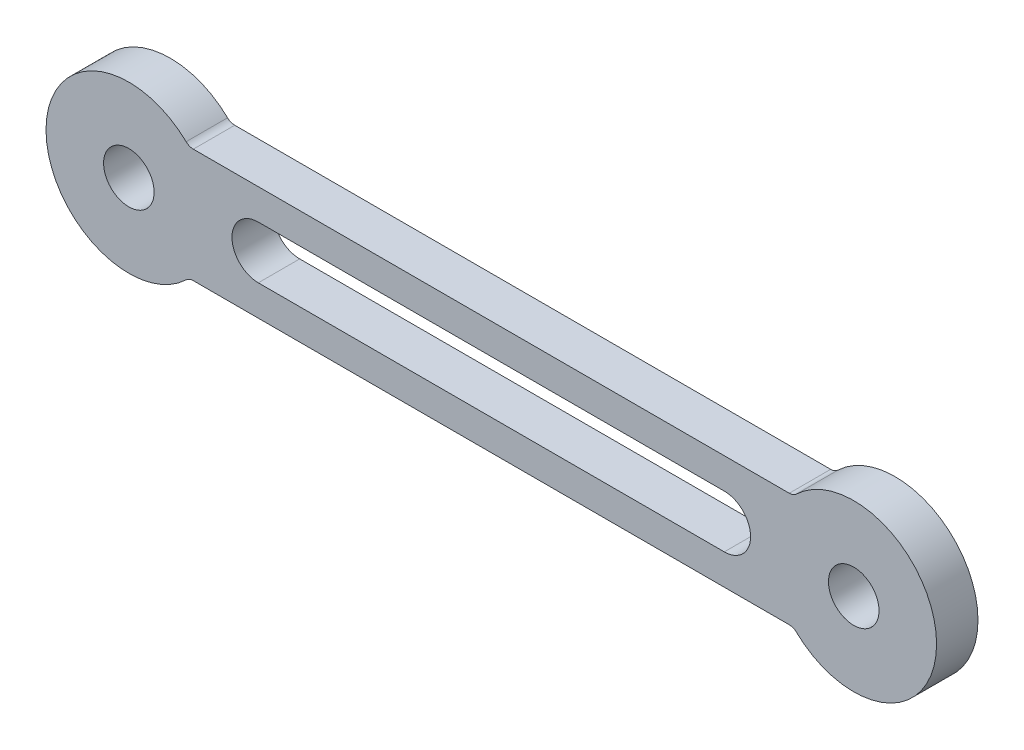
ISO-10303-21;
HEADER;
FILE_DESCRIPTION(('STEP AP214'),'2;1');
FILE_NAME('part.step','',(''),(''),'','','');
FILE_SCHEMA(('AUTOMOTIVE_DESIGN { 1 0 10303 214 1 1 1 1 }'));
ENDSEC;
DATA;
#1=APPLICATION_CONTEXT('core data for automotive mechanical design processes');
#2=APPLICATION_PROTOCOL_DEFINITION('international standard','automotive_design',2000,#1);
#3=PRODUCT_CONTEXT('',#1,'mechanical');
#4=PRODUCT('Part','Part','',(#3));
#5=PRODUCT_RELATED_PRODUCT_CATEGORY('part','',(#4));
#6=PRODUCT_DEFINITION_FORMATION('','',#4);
#7=PRODUCT_DEFINITION_CONTEXT('part definition',#1,'design');
#8=PRODUCT_DEFINITION('design','',#6,#7);
#9=PRODUCT_DEFINITION_SHAPE('','',#8);
#10=(LENGTH_UNIT() NAMED_UNIT(*) SI_UNIT(.MILLI.,.METRE.));
#11=(NAMED_UNIT(*) PLANE_ANGLE_UNIT() SI_UNIT($,.RADIAN.));
#12=(NAMED_UNIT(*) SI_UNIT($,.STERADIAN.) SOLID_ANGLE_UNIT());
#13=UNCERTAINTY_MEASURE_WITH_UNIT(LENGTH_MEASURE(1.E-05),#10,'distance_accuracy_value','');
#14=(GEOMETRIC_REPRESENTATION_CONTEXT(3) GLOBAL_UNCERTAINTY_ASSIGNED_CONTEXT((#13)) GLOBAL_UNIT_ASSIGNED_CONTEXT((#10,
#11,#12)) REPRESENTATION_CONTEXT('',''));
#15=CARTESIAN_POINT('',(0.,0.,0.));
#16=DIRECTION('',(0.,0.,1.));
#17=DIRECTION('',(1.,0.,0.));
#18=AXIS2_PLACEMENT_3D('',#15,#16,#17);
#19=CARTESIAN_POINT('',(0.,-5.5,4.));
#20=DIRECTION('',(0.,1.,0.));
#21=DIRECTION('',(-1.,0.,0.));
#22=AXIS2_PLACEMENT_3D('',#19,#20,#21);
#23=PLANE('',#22);
#24=DIRECTION('',(1.,0.,0.));
#25=VECTOR('',#24,1.);
#26=CARTESIAN_POINT('',(0.,-5.5,0.));
#27=LINE('',#26,#25);
#28=CARTESIAN_POINT('',(-28.7750502010056,-5.5,0.));
#29=VERTEX_POINT('',#28);
#30=CARTESIAN_POINT('',(28.7750502010057,-5.5,0.));
#31=VERTEX_POINT('',#30);
#32=EDGE_CURVE('E189',#29,#31,#27,.T.);
#33=ORIENTED_EDGE('',*,*,#32,.T.);
#34=DIRECTION('',(0.,0.,1.));
#35=VECTOR('',#34,1.);
#36=CARTESIAN_POINT('',(28.7750502010057,-5.5,4.));
#37=LINE('',#36,#35);
#38=CARTESIAN_POINT('',(28.7750502010057,-5.5,4.));
#39=VERTEX_POINT('',#38);
#40=EDGE_CURVE('E58',#31,#39,#37,.T.);
#41=ORIENTED_EDGE('',*,*,#40,.T.);
#42=DIRECTION('',(1.,0.,0.));
#43=VECTOR('',#42,1.);
#44=CARTESIAN_POINT('',(0.,-5.5,4.));
#45=LINE('',#44,#43);
#46=CARTESIAN_POINT('',(-28.7750502010056,-5.5,4.));
#47=VERTEX_POINT('',#46);
#48=EDGE_CURVE('E163',#47,#39,#45,.T.);
#49=ORIENTED_EDGE('',*,*,#48,.F.);
#50=DIRECTION('',(0.,0.,1.));
#51=VECTOR('',#50,1.);
#52=CARTESIAN_POINT('',(-28.7750502010056,-5.5,0.));
#53=LINE('',#52,#51);
#54=EDGE_CURVE('E210',#47,#29,#53,.F.);
#55=ORIENTED_EDGE('',*,*,#54,.T.);
#56=EDGE_LOOP('',(#33,#41,#49,#55));
#57=FACE_BOUND('',#56,.T.);
#58=ADVANCED_FACE('F37',(#57),#23,.F.);
#59=CARTESIAN_POINT('',(35.,0.,4.));
#60=DIRECTION('',(0.,0.,-1.));
#61=DIRECTION('',(-1.,0.,0.));
#62=AXIS2_PLACEMENT_3D('',#59,#60,#61);
#63=CYLINDRICAL_SURFACE('',#62,7.99999999999999);
#64=CARTESIAN_POINT('',(35.,0.,4.));
#65=DIRECTION('',(0.,0.,1.));
#66=DIRECTION('',(1.,0.,0.));
#67=AXIS2_PLACEMENT_3D('',#64,#65,#66);
#68=CIRCLE('',#67,7.99999999999999);
#69=CARTESIAN_POINT('',(29.4667112897828,-5.77777777777778,4.));
#70=VERTEX_POINT('',#69);
#71=CARTESIAN_POINT('',(29.4667112897828,5.77777777777778,4.));
#72=VERTEX_POINT('',#71);
#73=EDGE_CURVE('E165',#70,#72,#68,.T.);
#74=ORIENTED_EDGE('',*,*,#73,.F.);
#75=DIRECTION('',(0.,0.,-1.));
#76=VECTOR('',#75,1.);
#77=CARTESIAN_POINT('',(29.4667112897828,-5.77777777777778,4.));
#78=LINE('',#77,#76);
#79=CARTESIAN_POINT('',(29.4667112897828,-5.77777777777778,0.));
#80=VERTEX_POINT('',#79);
#81=EDGE_CURVE('E230',#70,#80,#78,.T.);
#82=ORIENTED_EDGE('',*,*,#81,.T.);
#83=CARTESIAN_POINT('',(35.,0.,0.));
#84=DIRECTION('',(0.,0.,1.));
#85=DIRECTION('',(1.,0.,0.));
#86=AXIS2_PLACEMENT_3D('',#83,#84,#85);
#87=CIRCLE('',#86,7.99999999999999);
#88=CARTESIAN_POINT('',(29.4667112897828,5.77777777777778,0.));
#89=VERTEX_POINT('',#88);
#90=EDGE_CURVE('E191',#80,#89,#87,.T.);
#91=ORIENTED_EDGE('',*,*,#90,.T.);
#92=DIRECTION('',(0.,0.,-1.));
#93=VECTOR('',#92,1.);
#94=CARTESIAN_POINT('',(29.4667112897828,5.77777777777778,4.));
#95=LINE('',#94,#93);
#96=EDGE_CURVE('E222',#89,#72,#95,.F.);
#97=ORIENTED_EDGE('',*,*,#96,.T.);
#98=EDGE_LOOP('',(#74,#82,#91,#97));
#99=FACE_BOUND('',#98,.T.);
#100=ADVANCED_FACE('F236',(#99),#63,.T.);
#101=CARTESIAN_POINT('',(0.,5.5,4.));
#102=DIRECTION('',(0.,1.,0.));
#103=DIRECTION('',(-1.,0.,0.));
#104=AXIS2_PLACEMENT_3D('',#101,#102,#103);
#105=PLANE('',#104);
#106=DIRECTION('',(1.,0.,0.));
#107=VECTOR('',#106,1.);
#108=CARTESIAN_POINT('',(0.,5.5,4.));
#109=LINE('',#108,#107);
#110=CARTESIAN_POINT('',(-28.7750502010056,5.5,4.));
#111=VERTEX_POINT('',#110);
#112=CARTESIAN_POINT('',(28.7750502010056,5.5,4.));
#113=VERTEX_POINT('',#112);
#114=EDGE_CURVE('E167',#111,#113,#109,.T.);
#115=ORIENTED_EDGE('',*,*,#114,.T.);
#116=DIRECTION('',(0.,0.,-1.));
#117=VECTOR('',#116,1.);
#118=CARTESIAN_POINT('',(28.7750502010056,5.5,4.));
#119=LINE('',#118,#117);
#120=CARTESIAN_POINT('',(28.7750502010056,5.5,0.));
#121=VERTEX_POINT('',#120);
#122=EDGE_CURVE('E219',#113,#121,#119,.T.);
#123=ORIENTED_EDGE('',*,*,#122,.T.);
#124=DIRECTION('',(1.,0.,0.));
#125=VECTOR('',#124,1.);
#126=CARTESIAN_POINT('',(0.,5.5,0.));
#127=LINE('',#126,#125);
#128=CARTESIAN_POINT('',(-28.7750502010056,5.5,0.));
#129=VERTEX_POINT('',#128);
#130=EDGE_CURVE('E193',#129,#121,#127,.T.);
#131=ORIENTED_EDGE('',*,*,#130,.F.);
#132=DIRECTION('',(0.,0.,-1.));
#133=VECTOR('',#132,1.);
#134=CARTESIAN_POINT('',(-28.7750502010056,5.5,4.));
#135=LINE('',#134,#133);
#136=EDGE_CURVE('E204',#129,#111,#135,.F.);
#137=ORIENTED_EDGE('',*,*,#136,.T.);
#138=EDGE_LOOP('',(#115,#123,#131,#137));
#139=FACE_BOUND('',#138,.T.);
#140=ADVANCED_FACE('F250',(#139),#105,.T.);
#141=CARTESIAN_POINT('',(22.5,0.,4.));
#142=DIRECTION('',(0.,0.,-1.));
#143=DIRECTION('',(-1.,0.,0.));
#144=AXIS2_PLACEMENT_3D('',#141,#142,#143);
#145=CYLINDRICAL_SURFACE('',#144,2.54073400925871);
#146=CARTESIAN_POINT('',(22.5,0.,0.));
#147=DIRECTION('',(0.,0.,1.));
#148=DIRECTION('',(1.,0.,0.));
#149=AXIS2_PLACEMENT_3D('',#146,#147,#148);
#150=CIRCLE('',#149,2.54073400925871);
#151=CARTESIAN_POINT('',(22.5,-2.5407340092587,0.));
#152=VERTEX_POINT('',#151);
#153=CARTESIAN_POINT('',(22.5,2.54073400925871,0.));
#154=VERTEX_POINT('',#153);
#155=EDGE_CURVE('E131',#152,#154,#150,.T.);
#156=ORIENTED_EDGE('',*,*,#155,.F.);
#157=DIRECTION('',(0.,0.,-1.));
#158=VECTOR('',#157,1.);
#159=CARTESIAN_POINT('',(22.5,-2.5407340092587,4.));
#160=LINE('',#159,#158);
#161=CARTESIAN_POINT('',(22.5,-2.5407340092587,4.));
#162=VERTEX_POINT('',#161);
#163=EDGE_CURVE('E126',#162,#152,#160,.T.);
#164=ORIENTED_EDGE('',*,*,#163,.F.);
#165=CARTESIAN_POINT('',(22.5,0.,4.));
#166=DIRECTION('',(0.,0.,1.));
#167=DIRECTION('',(1.,0.,0.));
#168=AXIS2_PLACEMENT_3D('',#165,#166,#167);
#169=CIRCLE('',#168,2.54073400925871);
#170=CARTESIAN_POINT('',(22.5,2.54073400925871,4.));
#171=VERTEX_POINT('',#170);
#172=EDGE_CURVE('E129',#162,#171,#169,.T.);
#173=ORIENTED_EDGE('',*,*,#172,.T.);
#174=DIRECTION('',(0.,0.,-1.));
#175=VECTOR('',#174,1.);
#176=CARTESIAN_POINT('',(22.5,2.54073400925871,4.));
#177=LINE('',#176,#175);
#178=EDGE_CURVE('E173',#171,#154,#177,.T.);
#179=ORIENTED_EDGE('',*,*,#178,.T.);
#180=EDGE_LOOP('',(#156,#164,#173,#179));
#181=FACE_BOUND('',#180,.T.);
#182=ADVANCED_FACE('F128',(#181),#145,.F.);
#183=CARTESIAN_POINT('',(0.,-2.5407340092587,4.));
#184=DIRECTION('',(0.,1.,0.));
#185=DIRECTION('',(-1.,0.,0.));
#186=AXIS2_PLACEMENT_3D('',#183,#184,#185);
#187=PLANE('',#186);
#188=DIRECTION('',(1.,0.,0.));
#189=VECTOR('',#188,1.);
#190=CARTESIAN_POINT('',(0.,-2.5407340092587,0.));
#191=LINE('',#190,#189);
#192=CARTESIAN_POINT('',(-22.5,-2.54073400925871,0.));
#193=VERTEX_POINT('',#192);
#194=EDGE_CURVE('E175',#193,#152,#191,.T.);
#195=ORIENTED_EDGE('',*,*,#194,.F.);
#196=DIRECTION('',(0.,0.,-1.));
#197=VECTOR('',#196,1.);
#198=CARTESIAN_POINT('',(-22.5,-2.54073400925871,4.));
#199=LINE('',#198,#197);
#200=CARTESIAN_POINT('',(-22.5,-2.54073400925871,4.));
#201=VERTEX_POINT('',#200);
#202=EDGE_CURVE('E137',#201,#193,#199,.T.);
#203=ORIENTED_EDGE('',*,*,#202,.F.);
#204=DIRECTION('',(1.,0.,0.));
#205=VECTOR('',#204,1.);
#206=CARTESIAN_POINT('',(0.,-2.5407340092587,4.));
#207=LINE('',#206,#205);
#208=EDGE_CURVE('E144',#201,#162,#207,.T.);
#209=ORIENTED_EDGE('',*,*,#208,.T.);
#210=ORIENTED_EDGE('',*,*,#163,.T.);
#211=EDGE_LOOP('',(#195,#203,#209,#210));
#212=FACE_BOUND('',#211,.T.);
#213=ADVANCED_FACE('F151',(#212),#187,.T.);
#214=CARTESIAN_POINT('',(-22.5,0.,4.));
#215=DIRECTION('',(0.,0.,-1.));
#216=DIRECTION('',(-1.,0.,0.));
#217=AXIS2_PLACEMENT_3D('',#214,#215,#216);
#218=CYLINDRICAL_SURFACE('',#217,2.54073400925871);
#219=CARTESIAN_POINT('',(-22.5,0.,0.));
#220=DIRECTION('',(0.,0.,1.));
#221=DIRECTION('',(1.,0.,0.));
#222=AXIS2_PLACEMENT_3D('',#219,#220,#221);
#223=CIRCLE('',#222,2.54073400925871);
#224=CARTESIAN_POINT('',(-22.5,2.54073400925871,0.));
#225=VERTEX_POINT('',#224);
#226=EDGE_CURVE('E177',#225,#193,#223,.T.);
#227=ORIENTED_EDGE('',*,*,#226,.F.);
#228=DIRECTION('',(0.,0.,-1.));
#229=VECTOR('',#228,1.);
#230=CARTESIAN_POINT('',(-22.5,2.54073400925871,4.));
#231=LINE('',#230,#229);
#232=CARTESIAN_POINT('',(-22.5,2.54073400925871,4.));
#233=VERTEX_POINT('',#232);
#234=EDGE_CURVE('E199',#233,#225,#231,.T.);
#235=ORIENTED_EDGE('',*,*,#234,.F.);
#236=CARTESIAN_POINT('',(-22.5,0.,4.));
#237=DIRECTION('',(0.,0.,1.));
#238=DIRECTION('',(1.,0.,0.));
#239=AXIS2_PLACEMENT_3D('',#236,#237,#238);
#240=CIRCLE('',#239,2.54073400925871);
#241=EDGE_CURVE('E152',#233,#201,#240,.T.);
#242=ORIENTED_EDGE('',*,*,#241,.T.);
#243=ORIENTED_EDGE('',*,*,#202,.T.);
#244=EDGE_LOOP('',(#227,#235,#242,#243));
#245=FACE_BOUND('',#244,.T.);
#246=ADVANCED_FACE('F280',(#245),#218,.F.);
#247=CARTESIAN_POINT('',(-35.,0.,4.));
#248=DIRECTION('',(0.,0.,-1.));
#249=DIRECTION('',(-1.,0.,0.));
#250=AXIS2_PLACEMENT_3D('',#247,#248,#249);
#251=CYLINDRICAL_SURFACE('',#250,2.44);
#252=CARTESIAN_POINT('',(-35.,0.,4.));
#253=DIRECTION('',(0.,0.,1.));
#254=DIRECTION('',(1.,0.,0.));
#255=AXIS2_PLACEMENT_3D('',#252,#253,#254);
#256=CIRCLE('',#255,2.44);
#257=CARTESIAN_POINT('',(-32.56,0.,4.));
#258=VERTEX_POINT('',#257);
#259=EDGE_CURVE('E160',#258,#258,#256,.T.);
#260=ORIENTED_EDGE('',*,*,#259,.T.);
#261=EDGE_LOOP('',(#260));
#262=FACE_BOUND('',#261,.T.);
#263=CARTESIAN_POINT('',(-35.,0.,0.));
#264=DIRECTION('',(0.,0.,1.));
#265=DIRECTION('',(1.,0.,0.));
#266=AXIS2_PLACEMENT_3D('',#263,#264,#265);
#267=CIRCLE('',#266,2.44);
#268=CARTESIAN_POINT('',(-32.56,0.,0.));
#269=VERTEX_POINT('',#268);
#270=EDGE_CURVE('E186',#269,#269,#267,.T.);
#271=ORIENTED_EDGE('',*,*,#270,.F.);
#272=EDGE_LOOP('',(#271));
#273=FACE_BOUND('',#272,.T.);
#274=ADVANCED_FACE('F276',(#262,#273),#251,.F.);
#275=CARTESIAN_POINT('',(35.,0.,4.));
#276=DIRECTION('',(0.,0.,-1.));
#277=DIRECTION('',(-1.,0.,0.));
#278=AXIS2_PLACEMENT_3D('',#275,#276,#277);
#279=CYLINDRICAL_SURFACE('',#278,2.44);
#280=CARTESIAN_POINT('',(35.,0.,4.));
#281=DIRECTION('',(0.,0.,1.));
#282=DIRECTION('',(1.,0.,0.));
#283=AXIS2_PLACEMENT_3D('',#280,#281,#282);
#284=CIRCLE('',#283,2.44);
#285=CARTESIAN_POINT('',(37.44,0.,4.));
#286=VERTEX_POINT('',#285);
#287=EDGE_CURVE('E157',#286,#286,#284,.T.);
#288=ORIENTED_EDGE('',*,*,#287,.T.);
#289=EDGE_LOOP('',(#288));
#290=FACE_BOUND('',#289,.T.);
#291=CARTESIAN_POINT('',(35.,0.,0.));
#292=DIRECTION('',(0.,0.,1.));
#293=DIRECTION('',(1.,0.,0.));
#294=AXIS2_PLACEMENT_3D('',#291,#292,#293);
#295=CIRCLE('',#294,2.44);
#296=CARTESIAN_POINT('',(37.44,0.,0.));
#297=VERTEX_POINT('',#296);
#298=EDGE_CURVE('E183',#297,#297,#295,.T.);
#299=ORIENTED_EDGE('',*,*,#298,.F.);
#300=EDGE_LOOP('',(#299));
#301=FACE_BOUND('',#300,.T.);
#302=ADVANCED_FACE('F279',(#290,#301),#279,.F.);
#303=CARTESIAN_POINT('',(0.,2.54073400925871,4.));
#304=DIRECTION('',(0.,1.,0.));
#305=DIRECTION('',(-1.,0.,0.));
#306=AXIS2_PLACEMENT_3D('',#303,#304,#305);
#307=PLANE('',#306);
#308=DIRECTION('',(1.,0.,0.));
#309=VECTOR('',#308,1.);
#310=CARTESIAN_POINT('',(0.,2.54073400925871,0.));
#311=LINE('',#310,#309);
#312=EDGE_CURVE('E180',#225,#154,#311,.T.);
#313=ORIENTED_EDGE('',*,*,#312,.T.);
#314=ORIENTED_EDGE('',*,*,#178,.F.);
#315=DIRECTION('',(1.,0.,0.));
#316=VECTOR('',#315,1.);
#317=CARTESIAN_POINT('',(0.,2.54073400925871,4.));
#318=LINE('',#317,#316);
#319=EDGE_CURVE('E147',#233,#171,#318,.T.);
#320=ORIENTED_EDGE('',*,*,#319,.F.);
#321=ORIENTED_EDGE('',*,*,#234,.T.);
#322=EDGE_LOOP('',(#313,#314,#320,#321));
#323=FACE_BOUND('',#322,.T.);
#324=ADVANCED_FACE('F284',(#323),#307,.F.);
#325=CARTESIAN_POINT('',(-35.,0.,4.));
#326=DIRECTION('',(0.,0.,-1.));
#327=DIRECTION('',(-1.,0.,0.));
#328=AXIS2_PLACEMENT_3D('',#325,#326,#327);
#329=CYLINDRICAL_SURFACE('',#328,8.);
#330=CARTESIAN_POINT('',(-35.,0.,0.));
#331=DIRECTION('',(0.,0.,1.));
#332=DIRECTION('',(1.,0.,0.));
#333=AXIS2_PLACEMENT_3D('',#330,#331,#332);
#334=CIRCLE('',#333,8.);
#335=CARTESIAN_POINT('',(-29.4667112897828,5.77777777777778,0.));
#336=VERTEX_POINT('',#335);
#337=CARTESIAN_POINT('',(-29.4667112897828,-5.77777777777778,0.));
#338=VERTEX_POINT('',#337);
#339=EDGE_CURVE('E149',#336,#338,#334,.T.);
#340=ORIENTED_EDGE('',*,*,#339,.T.);
#341=DIRECTION('',(0.,0.,-1.));
#342=VECTOR('',#341,1.);
#343=CARTESIAN_POINT('',(-29.4667112897828,-5.77777777777778,4.));
#344=LINE('',#343,#342);
#345=CARTESIAN_POINT('',(-29.4667112897828,-5.77777777777778,4.));
#346=VERTEX_POINT('',#345);
#347=EDGE_CURVE('E213',#338,#346,#344,.F.);
#348=ORIENTED_EDGE('',*,*,#347,.T.);
#349=CARTESIAN_POINT('',(-35.,0.,4.));
#350=DIRECTION('',(0.,0.,1.));
#351=DIRECTION('',(1.,0.,0.));
#352=AXIS2_PLACEMENT_3D('',#349,#350,#351);
#353=CIRCLE('',#352,8.);
#354=CARTESIAN_POINT('',(-29.4667112897828,5.77777777777778,4.));
#355=VERTEX_POINT('',#354);
#356=EDGE_CURVE('E170',#355,#346,#353,.T.);
#357=ORIENTED_EDGE('',*,*,#356,.F.);
#358=DIRECTION('',(0.,0.,-1.));
#359=VECTOR('',#358,1.);
#360=CARTESIAN_POINT('',(-29.4667112897828,5.77777777777778,4.));
#361=LINE('',#360,#359);
#362=EDGE_CURVE('E136',#355,#336,#361,.T.);
#363=ORIENTED_EDGE('',*,*,#362,.T.);
#364=EDGE_LOOP('',(#340,#348,#357,#363));
#365=FACE_BOUND('',#364,.T.);
#366=ADVANCED_FACE('F258',(#365),#329,.T.);
#367=CARTESIAN_POINT('',(0.,0.,4.));
#368=DIRECTION('',(0.,0.,1.));
#369=DIRECTION('',(1.,0.,0.));
#370=AXIS2_PLACEMENT_3D('',#367,#368,#369);
#371=PLANE('',#370);
#372=ORIENTED_EDGE('',*,*,#172,.F.);
#373=ORIENTED_EDGE('',*,*,#208,.F.);
#374=ORIENTED_EDGE('',*,*,#241,.F.);
#375=ORIENTED_EDGE('',*,*,#319,.T.);
#376=EDGE_LOOP('',(#372,#373,#374,#375));
#377=FACE_BOUND('',#376,.T.);
#378=ORIENTED_EDGE('',*,*,#287,.F.);
#379=EDGE_LOOP('',(#378));
#380=FACE_BOUND('',#379,.T.);
#381=ORIENTED_EDGE('',*,*,#259,.F.);
#382=EDGE_LOOP('',(#381));
#383=FACE_BOUND('',#382,.T.);
#384=ORIENTED_EDGE('',*,*,#356,.T.);
#385=CARTESIAN_POINT('',(-28.7750502010056,-6.5,4.));
#386=DIRECTION('',(0.,0.,1.));
#387=DIRECTION('',(1.,0.,0.));
#388=AXIS2_PLACEMENT_3D('',#385,#386,#387);
#389=CIRCLE('',#388,1.);
#390=EDGE_CURVE('E217',#346,#47,#389,.F.);
#391=ORIENTED_EDGE('',*,*,#390,.T.);
#392=ORIENTED_EDGE('',*,*,#48,.T.);
#393=CARTESIAN_POINT('',(28.7750502010057,-6.5,4.));
#394=DIRECTION('',(0.,0.,1.));
#395=DIRECTION('',(1.,0.,0.));
#396=AXIS2_PLACEMENT_3D('',#393,#394,#395);
#397=CIRCLE('',#396,1.);
#398=EDGE_CURVE('E11',#39,#70,#397,.F.);
#399=ORIENTED_EDGE('',*,*,#398,.T.);
#400=ORIENTED_EDGE('',*,*,#73,.T.);
#401=CARTESIAN_POINT('',(28.7750502010056,6.5,4.));
#402=DIRECTION('',(0.,0.,1.));
#403=DIRECTION('',(1.,0.,0.));
#404=AXIS2_PLACEMENT_3D('',#401,#402,#403);
#405=CIRCLE('',#404,1.);
#406=EDGE_CURVE('E228',#72,#113,#405,.F.);
#407=ORIENTED_EDGE('',*,*,#406,.T.);
#408=ORIENTED_EDGE('',*,*,#114,.F.);
#409=CARTESIAN_POINT('',(-28.7750502010056,6.5,4.));
#410=DIRECTION('',(0.,0.,1.));
#411=DIRECTION('',(1.,0.,0.));
#412=AXIS2_PLACEMENT_3D('',#409,#410,#411);
#413=CIRCLE('',#412,1.);
#414=EDGE_CURVE('E208',#111,#355,#413,.F.);
#415=ORIENTED_EDGE('',*,*,#414,.T.);
#416=EDGE_LOOP('',(#384,#391,#392,#399,#400,#407,#408,#415));
#417=FACE_BOUND('',#416,.T.);
#418=ADVANCED_FACE('F141',(#377,#380,#383,#417),#371,.T.);
#419=CARTESIAN_POINT('',(0.,0.,0.));
#420=DIRECTION('',(0.,0.,1.));
#421=DIRECTION('',(1.,0.,0.));
#422=AXIS2_PLACEMENT_3D('',#419,#420,#421);
#423=PLANE('',#422);
#424=ORIENTED_EDGE('',*,*,#155,.T.);
#425=ORIENTED_EDGE('',*,*,#312,.F.);
#426=ORIENTED_EDGE('',*,*,#226,.T.);
#427=ORIENTED_EDGE('',*,*,#194,.T.);
#428=EDGE_LOOP('',(#424,#425,#426,#427));
#429=FACE_BOUND('',#428,.T.);
#430=ORIENTED_EDGE('',*,*,#298,.T.);
#431=EDGE_LOOP('',(#430));
#432=FACE_BOUND('',#431,.T.);
#433=ORIENTED_EDGE('',*,*,#270,.T.);
#434=EDGE_LOOP('',(#433));
#435=FACE_BOUND('',#434,.T.);
#436=ORIENTED_EDGE('',*,*,#32,.F.);
#437=CARTESIAN_POINT('',(-28.7750502010056,-6.5,0.));
#438=DIRECTION('',(0.,0.,1.));
#439=DIRECTION('',(1.,0.,0.));
#440=AXIS2_PLACEMENT_3D('',#437,#438,#439);
#441=CIRCLE('',#440,1.);
#442=EDGE_CURVE('E215',#29,#338,#441,.T.);
#443=ORIENTED_EDGE('',*,*,#442,.T.);
#444=ORIENTED_EDGE('',*,*,#339,.F.);
#445=CARTESIAN_POINT('',(-28.7750502010056,6.5,0.));
#446=DIRECTION('',(0.,0.,1.));
#447=DIRECTION('',(1.,0.,0.));
#448=AXIS2_PLACEMENT_3D('',#445,#446,#447);
#449=CIRCLE('',#448,1.);
#450=EDGE_CURVE('E206',#336,#129,#449,.T.);
#451=ORIENTED_EDGE('',*,*,#450,.T.);
#452=ORIENTED_EDGE('',*,*,#130,.T.);
#453=CARTESIAN_POINT('',(28.7750502010056,6.5,0.));
#454=DIRECTION('',(0.,0.,1.));
#455=DIRECTION('',(1.,0.,0.));
#456=AXIS2_PLACEMENT_3D('',#453,#454,#455);
#457=CIRCLE('',#456,1.);
#458=EDGE_CURVE('E225',#121,#89,#457,.T.);
#459=ORIENTED_EDGE('',*,*,#458,.T.);
#460=ORIENTED_EDGE('',*,*,#90,.F.);
#461=CARTESIAN_POINT('',(28.7750502010057,-6.5,0.));
#462=DIRECTION('',(0.,0.,1.));
#463=DIRECTION('',(1.,0.,0.));
#464=AXIS2_PLACEMENT_3D('',#461,#462,#463);
#465=CIRCLE('',#464,1.);
#466=EDGE_CURVE('E45',#80,#31,#465,.T.);
#467=ORIENTED_EDGE('',*,*,#466,.T.);
#468=EDGE_LOOP('',(#436,#443,#444,#451,#452,#459,#460,#467));
#469=FACE_BOUND('',#468,.T.);
#470=ADVANCED_FACE('F239',(#429,#432,#435,#469),#423,.F.);
#471=CARTESIAN_POINT('',(-28.7750502010056,6.5,4.));
#472=DIRECTION('',(0.,0.,-1.));
#473=DIRECTION('',(-1.,0.,0.));
#474=AXIS2_PLACEMENT_3D('',#471,#472,#473);
#475=CYLINDRICAL_SURFACE('',#474,1.);
#476=ORIENTED_EDGE('',*,*,#414,.F.);
#477=ORIENTED_EDGE('',*,*,#136,.F.);
#478=ORIENTED_EDGE('',*,*,#450,.F.);
#479=ORIENTED_EDGE('',*,*,#362,.F.);
#480=EDGE_LOOP('',(#476,#477,#478,#479));
#481=FACE_BOUND('',#480,.T.);
#482=ADVANCED_FACE('F253',(#481),#475,.F.);
#483=CARTESIAN_POINT('',(-28.7750502010056,-6.5,4.));
#484=DIRECTION('',(0.,0.,-1.));
#485=DIRECTION('',(-1.,0.,0.));
#486=AXIS2_PLACEMENT_3D('',#483,#484,#485);
#487=CYLINDRICAL_SURFACE('',#486,1.);
#488=ORIENTED_EDGE('',*,*,#390,.F.);
#489=ORIENTED_EDGE('',*,*,#347,.F.);
#490=ORIENTED_EDGE('',*,*,#442,.F.);
#491=ORIENTED_EDGE('',*,*,#54,.F.);
#492=EDGE_LOOP('',(#488,#489,#490,#491));
#493=FACE_BOUND('',#492,.T.);
#494=ADVANCED_FACE('F262',(#493),#487,.F.);
#495=CARTESIAN_POINT('',(28.7750502010056,6.5,4.));
#496=DIRECTION('',(0.,0.,-1.));
#497=DIRECTION('',(-1.,0.,0.));
#498=AXIS2_PLACEMENT_3D('',#495,#496,#497);
#499=CYLINDRICAL_SURFACE('',#498,1.);
#500=ORIENTED_EDGE('',*,*,#406,.F.);
#501=ORIENTED_EDGE('',*,*,#96,.F.);
#502=ORIENTED_EDGE('',*,*,#458,.F.);
#503=ORIENTED_EDGE('',*,*,#122,.F.);
#504=EDGE_LOOP('',(#500,#501,#502,#503));
#505=FACE_BOUND('',#504,.T.);
#506=ADVANCED_FACE('F245',(#505),#499,.F.);
#507=CARTESIAN_POINT('',(28.7750502010057,-6.5,4.));
#508=DIRECTION('',(0.,0.,-1.));
#509=DIRECTION('',(-1.,0.,0.));
#510=AXIS2_PLACEMENT_3D('',#507,#508,#509);
#511=CYLINDRICAL_SURFACE('',#510,1.);
#512=ORIENTED_EDGE('',*,*,#398,.F.);
#513=ORIENTED_EDGE('',*,*,#40,.F.);
#514=ORIENTED_EDGE('',*,*,#466,.F.);
#515=ORIENTED_EDGE('',*,*,#81,.F.);
#516=EDGE_LOOP('',(#512,#513,#514,#515));
#517=FACE_BOUND('',#516,.T.);
#518=ADVANCED_FACE('F39',(#517),#511,.F.);
#519=CLOSED_SHELL('',(#58,#100,#140,#182,#213,#246,#274,#302,#324,#366,#418,#470,#482,#494,#506,#518));
#520=MANIFOLD_SOLID_BREP('B2',#519);
#521=ADVANCED_BREP_SHAPE_REPRESENTATION('',(#18,#520),#14);
#522=SHAPE_DEFINITION_REPRESENTATION(#9,#521);
ENDSEC;
END-ISO-10303-21;
